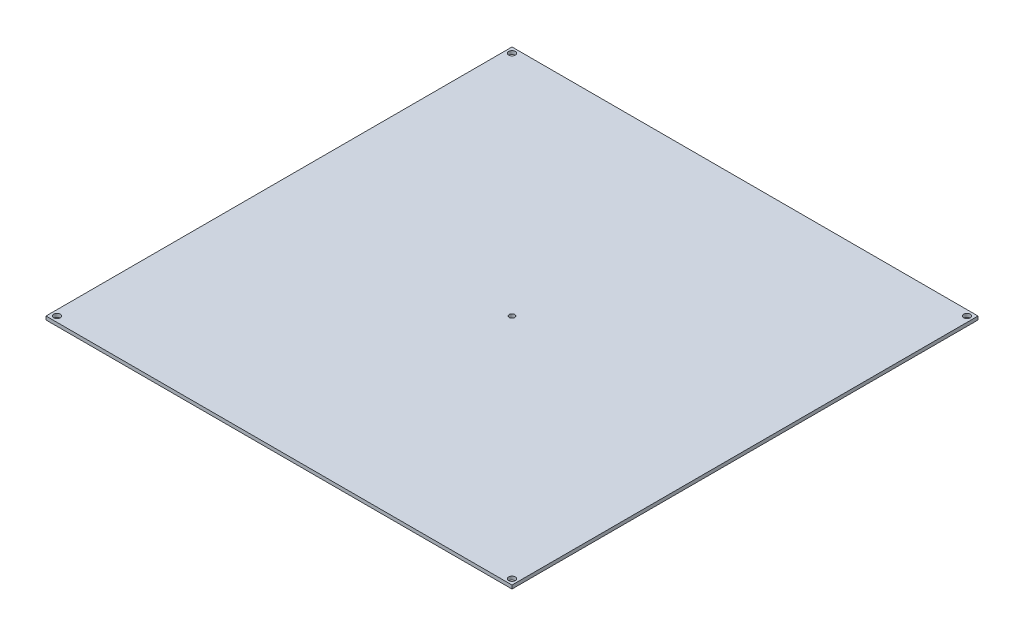
ISO-10303-21;
HEADER;
FILE_DESCRIPTION(('STEP AP214'),'2;1');
FILE_NAME('part.step','',(''),(''),'','','');
FILE_SCHEMA(('AUTOMOTIVE_DESIGN { 1 0 10303 214 1 1 1 1 }'));
ENDSEC;
DATA;
#1=APPLICATION_CONTEXT('core data for automotive mechanical design processes');
#2=APPLICATION_PROTOCOL_DEFINITION('international standard','automotive_design',2000,#1);
#3=PRODUCT_CONTEXT('',#1,'mechanical');
#4=PRODUCT('Part','Part','',(#3));
#5=PRODUCT_RELATED_PRODUCT_CATEGORY('part','',(#4));
#6=PRODUCT_DEFINITION_FORMATION('','',#4);
#7=PRODUCT_DEFINITION_CONTEXT('part definition',#1,'design');
#8=PRODUCT_DEFINITION('design','',#6,#7);
#9=PRODUCT_DEFINITION_SHAPE('','',#8);
#10=(LENGTH_UNIT() NAMED_UNIT(*) SI_UNIT(.MILLI.,.METRE.));
#11=(NAMED_UNIT(*) PLANE_ANGLE_UNIT() SI_UNIT($,.RADIAN.));
#12=(NAMED_UNIT(*) SI_UNIT($,.STERADIAN.) SOLID_ANGLE_UNIT());
#13=UNCERTAINTY_MEASURE_WITH_UNIT(LENGTH_MEASURE(1.E-05),#10,'distance_accuracy_value','');
#14=(GEOMETRIC_REPRESENTATION_CONTEXT(3) GLOBAL_UNCERTAINTY_ASSIGNED_CONTEXT((#13)) GLOBAL_UNIT_ASSIGNED_CONTEXT((#10,
#11,#12)) REPRESENTATION_CONTEXT('',''));
#15=CARTESIAN_POINT('',(0.,0.,0.));
#16=DIRECTION('',(0.,0.,1.));
#17=DIRECTION('',(1.,0.,0.));
#18=AXIS2_PLACEMENT_3D('',#15,#16,#17);
#19=CARTESIAN_POINT('',(107.,1.6,-107.));
#20=DIRECTION('',(-1.,0.,0.));
#21=DIRECTION('',(0.,0.,1.));
#22=AXIS2_PLACEMENT_3D('',#19,#20,#21);
#23=PLANE('',#22);
#24=DIRECTION('',(0.,0.,-1.));
#25=VECTOR('',#24,1.);
#26=CARTESIAN_POINT('',(107.,0.,-107.));
#27=LINE('',#26,#25);
#28=CARTESIAN_POINT('',(107.,0.,107.));
#29=VERTEX_POINT('',#28);
#30=CARTESIAN_POINT('',(107.,0.,-107.));
#31=VERTEX_POINT('',#30);
#32=EDGE_CURVE('E96',#29,#31,#27,.T.);
#33=ORIENTED_EDGE('',*,*,#32,.T.);
#34=DIRECTION('',(0.,-1.,0.));
#35=VECTOR('',#34,1.);
#36=CARTESIAN_POINT('',(107.,1.6,-107.));
#37=LINE('',#36,#35);
#38=CARTESIAN_POINT('',(107.,1.6,-107.));
#39=VERTEX_POINT('',#38);
#40=EDGE_CURVE('E11',#39,#31,#37,.T.);
#41=ORIENTED_EDGE('',*,*,#40,.F.);
#42=DIRECTION('',(0.,0.,-1.));
#43=VECTOR('',#42,1.);
#44=CARTESIAN_POINT('',(107.,1.6,-107.));
#45=LINE('',#44,#43);
#46=CARTESIAN_POINT('',(107.,1.6,107.));
#47=VERTEX_POINT('',#46);
#48=EDGE_CURVE('E84',#47,#39,#45,.T.);
#49=ORIENTED_EDGE('',*,*,#48,.F.);
#50=DIRECTION('',(0.,-1.,0.));
#51=VECTOR('',#50,1.);
#52=CARTESIAN_POINT('',(107.,1.6,107.));
#53=LINE('',#52,#51);
#54=EDGE_CURVE('E92',#47,#29,#53,.T.);
#55=ORIENTED_EDGE('',*,*,#54,.T.);
#56=EDGE_LOOP('',(#33,#41,#49,#55));
#57=FACE_BOUND('',#56,.T.);
#58=ADVANCED_FACE('F33',(#57),#23,.F.);
#59=CARTESIAN_POINT('',(-107.,1.6,-107.));
#60=DIRECTION('',(0.,0.,1.));
#61=DIRECTION('',(1.,0.,0.));
#62=AXIS2_PLACEMENT_3D('',#59,#60,#61);
#63=PLANE('',#62);
#64=DIRECTION('',(-1.,0.,0.));
#65=VECTOR('',#64,1.);
#66=CARTESIAN_POINT('',(-107.,0.,-107.));
#67=LINE('',#66,#65);
#68=CARTESIAN_POINT('',(-107.,0.,-107.));
#69=VERTEX_POINT('',#68);
#70=EDGE_CURVE('E88',#31,#69,#67,.T.);
#71=ORIENTED_EDGE('',*,*,#70,.T.);
#72=DIRECTION('',(0.,-1.,0.));
#73=VECTOR('',#72,1.);
#74=CARTESIAN_POINT('',(-107.,1.6,-107.));
#75=LINE('',#74,#73);
#76=CARTESIAN_POINT('',(-107.,1.6,-107.));
#77=VERTEX_POINT('',#76);
#78=EDGE_CURVE('E41',#77,#69,#75,.T.);
#79=ORIENTED_EDGE('',*,*,#78,.F.);
#80=DIRECTION('',(-1.,0.,0.));
#81=VECTOR('',#80,1.);
#82=CARTESIAN_POINT('',(-107.,1.6,-107.));
#83=LINE('',#82,#81);
#84=EDGE_CURVE('E79',#39,#77,#83,.T.);
#85=ORIENTED_EDGE('',*,*,#84,.F.);
#86=ORIENTED_EDGE('',*,*,#40,.T.);
#87=EDGE_LOOP('',(#71,#79,#85,#86));
#88=FACE_BOUND('',#87,.T.);
#89=ADVANCED_FACE('F87',(#88),#63,.F.);
#90=CARTESIAN_POINT('',(-107.,1.6,-107.));
#91=DIRECTION('',(1.,0.,0.));
#92=DIRECTION('',(0.,0.,-1.));
#93=AXIS2_PLACEMENT_3D('',#90,#91,#92);
#94=PLANE('',#93);
#95=DIRECTION('',(0.,0.,1.));
#96=VECTOR('',#95,1.);
#97=CARTESIAN_POINT('',(-107.,0.,-107.));
#98=LINE('',#97,#96);
#99=CARTESIAN_POINT('',(-107.,0.,107.));
#100=VERTEX_POINT('',#99);
#101=EDGE_CURVE('E66',#69,#100,#98,.T.);
#102=ORIENTED_EDGE('',*,*,#101,.T.);
#103=DIRECTION('',(0.,-1.,0.));
#104=VECTOR('',#103,1.);
#105=CARTESIAN_POINT('',(-107.,1.6,107.));
#106=LINE('',#105,#104);
#107=CARTESIAN_POINT('',(-107.,1.6,107.));
#108=VERTEX_POINT('',#107);
#109=EDGE_CURVE('E89',#108,#100,#106,.T.);
#110=ORIENTED_EDGE('',*,*,#109,.F.);
#111=DIRECTION('',(0.,0.,1.));
#112=VECTOR('',#111,1.);
#113=CARTESIAN_POINT('',(-107.,1.6,-107.));
#114=LINE('',#113,#112);
#115=EDGE_CURVE('E82',#77,#108,#114,.T.);
#116=ORIENTED_EDGE('',*,*,#115,.F.);
#117=ORIENTED_EDGE('',*,*,#78,.T.);
#118=EDGE_LOOP('',(#102,#110,#116,#117));
#119=FACE_BOUND('',#118,.T.);
#120=ADVANCED_FACE('F90',(#119),#94,.F.);
#121=CARTESIAN_POINT('',(-107.,1.6,107.));
#122=DIRECTION('',(0.,0.,-1.));
#123=DIRECTION('',(-1.,0.,0.));
#124=AXIS2_PLACEMENT_3D('',#121,#122,#123);
#125=PLANE('',#124);
#126=DIRECTION('',(1.,0.,0.));
#127=VECTOR('',#126,1.);
#128=CARTESIAN_POINT('',(-107.,0.,107.));
#129=LINE('',#128,#127);
#130=EDGE_CURVE('E72',#100,#29,#129,.T.);
#131=ORIENTED_EDGE('',*,*,#130,.T.);
#132=ORIENTED_EDGE('',*,*,#54,.F.);
#133=DIRECTION('',(1.,0.,0.));
#134=VECTOR('',#133,1.);
#135=CARTESIAN_POINT('',(-107.,1.6,107.));
#136=LINE('',#135,#134);
#137=EDGE_CURVE('E49',#108,#47,#136,.T.);
#138=ORIENTED_EDGE('',*,*,#137,.F.);
#139=ORIENTED_EDGE('',*,*,#109,.T.);
#140=EDGE_LOOP('',(#131,#132,#138,#139));
#141=FACE_BOUND('',#140,.T.);
#142=ADVANCED_FACE('F104',(#141),#125,.F.);
#143=CARTESIAN_POINT('',(107.,1.6,107.));
#144=DIRECTION('',(0.,1.,0.));
#145=DIRECTION('',(0.,0.,1.));
#146=AXIS2_PLACEMENT_3D('',#143,#144,#145);
#147=PLANE('',#146);
#148=CARTESIAN_POINT('',(0.,1.6,0.));
#149=DIRECTION('',(0.,1.,0.));
#150=DIRECTION('',(0.,0.,1.));
#151=AXIS2_PLACEMENT_3D('',#148,#149,#150);
#152=CIRCLE('',#151,1.25);
#153=CARTESIAN_POINT('',(0.,1.6,1.25));
#154=VERTEX_POINT('',#153);
#155=EDGE_CURVE('E134',#154,#154,#152,.T.);
#156=ORIENTED_EDGE('',*,*,#155,.F.);
#157=EDGE_LOOP('',(#156));
#158=FACE_BOUND('',#157,.T.);
#159=CARTESIAN_POINT('',(-104.5,1.6,104.5));
#160=DIRECTION('',(0.,1.,0.));
#161=DIRECTION('',(0.,0.,-1.));
#162=AXIS2_PLACEMENT_3D('',#159,#160,#161);
#163=CIRCLE('',#162,1.5);
#164=CARTESIAN_POINT('',(-104.5,1.6,103.));
#165=VERTEX_POINT('',#164);
#166=EDGE_CURVE('E128',#165,#165,#163,.T.);
#167=ORIENTED_EDGE('',*,*,#166,.F.);
#168=EDGE_LOOP('',(#167));
#169=FACE_BOUND('',#168,.T.);
#170=CARTESIAN_POINT('',(104.5,1.6,104.5));
#171=DIRECTION('',(0.,1.,0.));
#172=DIRECTION('',(0.,0.,1.));
#173=AXIS2_PLACEMENT_3D('',#170,#171,#172);
#174=CIRCLE('',#173,1.5);
#175=CARTESIAN_POINT('',(104.5,1.6,106.));
#176=VERTEX_POINT('',#175);
#177=EDGE_CURVE('E122',#176,#176,#174,.T.);
#178=ORIENTED_EDGE('',*,*,#177,.F.);
#179=EDGE_LOOP('',(#178));
#180=FACE_BOUND('',#179,.T.);
#181=CARTESIAN_POINT('',(104.5,1.6,-104.5));
#182=DIRECTION('',(0.,1.,0.));
#183=DIRECTION('',(0.,0.,-1.));
#184=AXIS2_PLACEMENT_3D('',#181,#182,#183);
#185=CIRCLE('',#184,1.5);
#186=CARTESIAN_POINT('',(104.5,1.6,-106.));
#187=VERTEX_POINT('',#186);
#188=EDGE_CURVE('E116',#187,#187,#185,.T.);
#189=ORIENTED_EDGE('',*,*,#188,.F.);
#190=EDGE_LOOP('',(#189));
#191=FACE_BOUND('',#190,.T.);
#192=CARTESIAN_POINT('',(-104.5,1.6,-104.5));
#193=DIRECTION('',(0.,1.,0.));
#194=DIRECTION('',(0.,0.,1.));
#195=AXIS2_PLACEMENT_3D('',#192,#193,#194);
#196=CIRCLE('',#195,1.5);
#197=CARTESIAN_POINT('',(-104.5,1.6,-103.));
#198=VERTEX_POINT('',#197);
#199=EDGE_CURVE('E110',#198,#198,#196,.T.);
#200=ORIENTED_EDGE('',*,*,#199,.F.);
#201=EDGE_LOOP('',(#200));
#202=FACE_BOUND('',#201,.T.);
#203=ORIENTED_EDGE('',*,*,#48,.T.);
#204=ORIENTED_EDGE('',*,*,#84,.T.);
#205=ORIENTED_EDGE('',*,*,#115,.T.);
#206=ORIENTED_EDGE('',*,*,#137,.T.);
#207=EDGE_LOOP('',(#203,#204,#205,#206));
#208=FACE_BOUND('',#207,.T.);
#209=ADVANCED_FACE('F80',(#158,#169,#180,#191,#202,#208),#147,.T.);
#210=CARTESIAN_POINT('',(107.,0.,107.));
#211=DIRECTION('',(0.,1.,0.));
#212=DIRECTION('',(0.,0.,1.));
#213=AXIS2_PLACEMENT_3D('',#210,#211,#212);
#214=PLANE('',#213);
#215=CARTESIAN_POINT('',(0.,0.,0.));
#216=DIRECTION('',(0.,1.,0.));
#217=DIRECTION('',(0.,0.,1.));
#218=AXIS2_PLACEMENT_3D('',#215,#216,#217);
#219=CIRCLE('',#218,1.25);
#220=CARTESIAN_POINT('',(0.,0.,1.25));
#221=VERTEX_POINT('',#220);
#222=EDGE_CURVE('E131',#221,#221,#219,.T.);
#223=ORIENTED_EDGE('',*,*,#222,.T.);
#224=EDGE_LOOP('',(#223));
#225=FACE_BOUND('',#224,.T.);
#226=CARTESIAN_POINT('',(-104.5,0.,104.5));
#227=DIRECTION('',(0.,1.,0.));
#228=DIRECTION('',(0.,0.,-1.));
#229=AXIS2_PLACEMENT_3D('',#226,#227,#228);
#230=CIRCLE('',#229,1.5);
#231=CARTESIAN_POINT('',(-104.5,0.,103.));
#232=VERTEX_POINT('',#231);
#233=EDGE_CURVE('E125',#232,#232,#230,.T.);
#234=ORIENTED_EDGE('',*,*,#233,.T.);
#235=EDGE_LOOP('',(#234));
#236=FACE_BOUND('',#235,.T.);
#237=CARTESIAN_POINT('',(104.5,0.,104.5));
#238=DIRECTION('',(0.,1.,0.));
#239=DIRECTION('',(0.,0.,1.));
#240=AXIS2_PLACEMENT_3D('',#237,#238,#239);
#241=CIRCLE('',#240,1.5);
#242=CARTESIAN_POINT('',(104.5,0.,106.));
#243=VERTEX_POINT('',#242);
#244=EDGE_CURVE('E119',#243,#243,#241,.T.);
#245=ORIENTED_EDGE('',*,*,#244,.T.);
#246=EDGE_LOOP('',(#245));
#247=FACE_BOUND('',#246,.T.);
#248=CARTESIAN_POINT('',(104.5,0.,-104.5));
#249=DIRECTION('',(0.,1.,0.));
#250=DIRECTION('',(0.,0.,-1.));
#251=AXIS2_PLACEMENT_3D('',#248,#249,#250);
#252=CIRCLE('',#251,1.5);
#253=CARTESIAN_POINT('',(104.5,0.,-106.));
#254=VERTEX_POINT('',#253);
#255=EDGE_CURVE('E113',#254,#254,#252,.T.);
#256=ORIENTED_EDGE('',*,*,#255,.T.);
#257=EDGE_LOOP('',(#256));
#258=FACE_BOUND('',#257,.T.);
#259=CARTESIAN_POINT('',(-104.5,0.,-104.5));
#260=DIRECTION('',(0.,1.,0.));
#261=DIRECTION('',(0.,0.,1.));
#262=AXIS2_PLACEMENT_3D('',#259,#260,#261);
#263=CIRCLE('',#262,1.5);
#264=CARTESIAN_POINT('',(-104.5,0.,-103.));
#265=VERTEX_POINT('',#264);
#266=EDGE_CURVE('E99',#265,#265,#263,.T.);
#267=ORIENTED_EDGE('',*,*,#266,.T.);
#268=EDGE_LOOP('',(#267));
#269=FACE_BOUND('',#268,.T.);
#270=ORIENTED_EDGE('',*,*,#32,.F.);
#271=ORIENTED_EDGE('',*,*,#130,.F.);
#272=ORIENTED_EDGE('',*,*,#101,.F.);
#273=ORIENTED_EDGE('',*,*,#70,.F.);
#274=EDGE_LOOP('',(#270,#271,#272,#273));
#275=FACE_BOUND('',#274,.T.);
#276=ADVANCED_FACE('F107',(#225,#236,#247,#258,#269,#275),#214,.F.);
#277=CARTESIAN_POINT('',(-104.5,0.,-104.5));
#278=DIRECTION('',(0.,1.,0.));
#279=DIRECTION('',(0.,0.,1.));
#280=AXIS2_PLACEMENT_3D('',#277,#278,#279);
#281=CYLINDRICAL_SURFACE('',#280,1.5);
#282=ORIENTED_EDGE('',*,*,#266,.F.);
#283=EDGE_LOOP('',(#282));
#284=FACE_BOUND('',#283,.T.);
#285=ORIENTED_EDGE('',*,*,#199,.T.);
#286=EDGE_LOOP('',(#285));
#287=FACE_BOUND('',#286,.T.);
#288=ADVANCED_FACE('F160',(#284,#287),#281,.F.);
#289=CARTESIAN_POINT('',(104.5,0.,-104.5));
#290=DIRECTION('',(0.,1.,0.));
#291=DIRECTION('',(0.,0.,1.));
#292=AXIS2_PLACEMENT_3D('',#289,#290,#291);
#293=CYLINDRICAL_SURFACE('',#292,1.5);
#294=ORIENTED_EDGE('',*,*,#255,.F.);
#295=EDGE_LOOP('',(#294));
#296=FACE_BOUND('',#295,.T.);
#297=ORIENTED_EDGE('',*,*,#188,.T.);
#298=EDGE_LOOP('',(#297));
#299=FACE_BOUND('',#298,.T.);
#300=ADVANCED_FACE('F162',(#296,#299),#293,.F.);
#301=CARTESIAN_POINT('',(104.5,0.,104.5));
#302=DIRECTION('',(0.,1.,0.));
#303=DIRECTION('',(0.,0.,1.));
#304=AXIS2_PLACEMENT_3D('',#301,#302,#303);
#305=CYLINDRICAL_SURFACE('',#304,1.5);
#306=ORIENTED_EDGE('',*,*,#244,.F.);
#307=EDGE_LOOP('',(#306));
#308=FACE_BOUND('',#307,.T.);
#309=ORIENTED_EDGE('',*,*,#177,.T.);
#310=EDGE_LOOP('',(#309));
#311=FACE_BOUND('',#310,.T.);
#312=ADVANCED_FACE('F169',(#308,#311),#305,.F.);
#313=CARTESIAN_POINT('',(-104.5,0.,104.5));
#314=DIRECTION('',(0.,1.,0.));
#315=DIRECTION('',(0.,0.,1.));
#316=AXIS2_PLACEMENT_3D('',#313,#314,#315);
#317=CYLINDRICAL_SURFACE('',#316,1.5);
#318=ORIENTED_EDGE('',*,*,#233,.F.);
#319=EDGE_LOOP('',(#318));
#320=FACE_BOUND('',#319,.T.);
#321=ORIENTED_EDGE('',*,*,#166,.T.);
#322=EDGE_LOOP('',(#321));
#323=FACE_BOUND('',#322,.T.);
#324=ADVANCED_FACE('F145',(#320,#323),#317,.F.);
#325=CARTESIAN_POINT('',(0.,0.,0.));
#326=DIRECTION('',(0.,1.,0.));
#327=DIRECTION('',(0.,0.,1.));
#328=AXIS2_PLACEMENT_3D('',#325,#326,#327);
#329=CYLINDRICAL_SURFACE('',#328,1.25);
#330=ORIENTED_EDGE('',*,*,#222,.F.);
#331=EDGE_LOOP('',(#330));
#332=FACE_BOUND('',#331,.T.);
#333=ORIENTED_EDGE('',*,*,#155,.T.);
#334=EDGE_LOOP('',(#333));
#335=FACE_BOUND('',#334,.T.);
#336=ADVANCED_FACE('F142',(#332,#335),#329,.F.);
#337=CLOSED_SHELL('',(#58,#89,#120,#142,#209,#276,#288,#300,#312,#324,#336));
#338=MANIFOLD_SOLID_BREP('B2',#337);
#339=ADVANCED_BREP_SHAPE_REPRESENTATION('',(#18,#338),#14);
#340=SHAPE_DEFINITION_REPRESENTATION(#9,#339);
ENDSEC;
END-ISO-10303-21;
